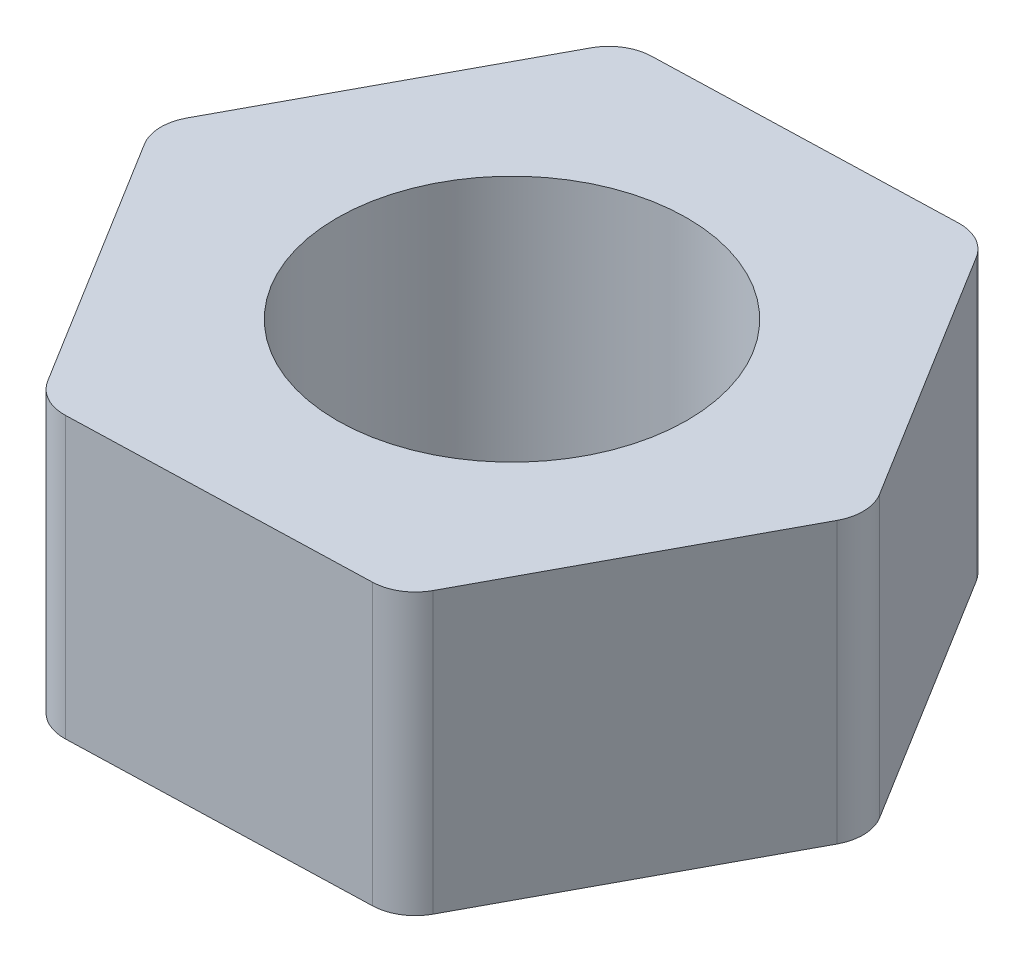
ISO-10303-21;
HEADER;
FILE_DESCRIPTION(('STEP AP214'),'2;1');
FILE_NAME('part.step','',(''),(''),'','','');
FILE_SCHEMA(('AUTOMOTIVE_DESIGN { 1 0 10303 214 1 1 1 1 }'));
ENDSEC;
DATA;
#1=APPLICATION_CONTEXT('core data for automotive mechanical design processes');
#2=APPLICATION_PROTOCOL_DEFINITION('international standard','automotive_design',2000,#1);
#3=PRODUCT_CONTEXT('',#1,'mechanical');
#4=PRODUCT('Part','Part','',(#3));
#5=PRODUCT_RELATED_PRODUCT_CATEGORY('part','',(#4));
#6=PRODUCT_DEFINITION_FORMATION('','',#4);
#7=PRODUCT_DEFINITION_CONTEXT('part definition',#1,'design');
#8=PRODUCT_DEFINITION('design','',#6,#7);
#9=PRODUCT_DEFINITION_SHAPE('','',#8);
#10=(LENGTH_UNIT() NAMED_UNIT(*) SI_UNIT(.MILLI.,.METRE.));
#11=(NAMED_UNIT(*) PLANE_ANGLE_UNIT() SI_UNIT($,.RADIAN.));
#12=(NAMED_UNIT(*) SI_UNIT($,.STERADIAN.) SOLID_ANGLE_UNIT());
#13=UNCERTAINTY_MEASURE_WITH_UNIT(LENGTH_MEASURE(1.E-05),#10,'distance_accuracy_value','');
#14=(GEOMETRIC_REPRESENTATION_CONTEXT(3) GLOBAL_UNCERTAINTY_ASSIGNED_CONTEXT((#13)) GLOBAL_UNIT_ASSIGNED_CONTEXT((#10,
#11,#12)) REPRESENTATION_CONTEXT('',''));
#15=CARTESIAN_POINT('',(0.,0.,0.));
#16=DIRECTION('',(0.,0.,1.));
#17=DIRECTION('',(1.,0.,0.));
#18=AXIS2_PLACEMENT_3D('',#15,#16,#17);
#19=CARTESIAN_POINT('',(0.,3.2,0.));
#20=DIRECTION('',(0.,1.,0.));
#21=DIRECTION('',(0.,0.,1.));
#22=AXIS2_PLACEMENT_3D('',#19,#20,#21);
#23=PLANE('',#22);
#24=DIRECTION('',(-0.473531335602983,0.,0.880776971884515));
#25=VECTOR('',#24,1.);
#26=CARTESIAN_POINT('',(-2.09547317092521,3.2,-3.38806614308703));
#27=LINE('',#26,#25);
#28=CARTESIAN_POINT('',(-2.23216989296526,3.2,-3.13380773218026));
#29=VERTEX_POINT('',#28);
#30=CARTESIAN_POINT('',(-3.84519121303789,3.2,-0.133558483480325));
#31=VERTEX_POINT('',#30);
#32=EDGE_CURVE('E268',#29,#31,#27,.T.);
#33=ORIENTED_EDGE('',*,*,#32,.T.);
#34=CARTESIAN_POINT('',(-3.40480272709563,3.2,0.103207184321166));
#35=DIRECTION('',(0.,1.,0.));
#36=DIRECTION('',(0.,0.,1.));
#37=AXIS2_PLACEMENT_3D('',#34,#35,#36);
#38=CIRCLE('',#37,0.5);
#39=CARTESIAN_POINT('',(-3.83004205312684,3.2,0.366211966780582));
#40=VERTEX_POINT('',#39);
#41=EDGE_CURVE('E206',#31,#40,#38,.T.);
#42=ORIENTED_EDGE('',*,*,#41,.T.);
#43=DIRECTION('',(0.526009564918831,0.,0.850478652062415));
#44=VECTOR('',#43,1.);
#45=CARTESIAN_POINT('',(-3.98188793507794,3.2,0.120699927426449));
#46=LINE('',#45,#44);
#47=CARTESIAN_POINT('',(-2.03826064610383,3.2,3.26325403115935));
#48=VERTEX_POINT('',#47);
#49=EDGE_CURVE('E151',#40,#48,#46,.T.);
#50=ORIENTED_EDGE('',*,*,#49,.T.);
#51=CARTESIAN_POINT('',(-1.61302132007262,3.2,3.00024924869993));
#52=DIRECTION('',(0.,1.,0.));
#53=DIRECTION('',(0.,0.,1.));
#54=AXIS2_PLACEMENT_3D('',#51,#52,#53);
#55=CIRCLE('',#54,0.5);
#56=CARTESIAN_POINT('',(-1.59787216016157,3.2,3.50001969896084));
#57=VERTEX_POINT('',#56);
#58=EDGE_CURVE('E192',#48,#57,#55,.T.);
#59=ORIENTED_EDGE('',*,*,#58,.T.);
#60=DIRECTION('',(0.999540900521813,0.,-0.0302983198220993));
#61=VECTOR('',#60,1.);
#62=CARTESIAN_POINT('',(-1.88641476415272,3.2,3.50876607051348));
#63=LINE('',#62,#61);
#64=CARTESIAN_POINT('',(1.80693056693406,3.2,3.39681251463967));
#65=VERTEX_POINT('',#64);
#66=EDGE_CURVE('E160',#57,#65,#63,.T.);
#67=ORIENTED_EDGE('',*,*,#66,.T.);
#68=CARTESIAN_POINT('',(1.79178140702301,3.2,2.89704206437877));
#69=DIRECTION('',(0.,1.,0.));
#70=DIRECTION('',(0.,0.,1.));
#71=AXIS2_PLACEMENT_3D('',#68,#69,#70);
#72=CIRCLE('',#71,0.5);
#73=CARTESIAN_POINT('',(2.23216989296527,3.2,3.13380773218026));
#74=VERTEX_POINT('',#73);
#75=EDGE_CURVE('E195',#65,#74,#72,.T.);
#76=ORIENTED_EDGE('',*,*,#75,.T.);
#77=DIRECTION('',(0.473531335602983,0.,-0.880776971884515));
#78=VECTOR('',#77,1.);
#79=CARTESIAN_POINT('',(2.09547317092521,3.2,3.38806614308703));
#80=LINE('',#79,#78);
#81=CARTESIAN_POINT('',(3.84519121303789,3.2,0.133558483480324));
#82=VERTEX_POINT('',#81);
#83=EDGE_CURVE('E166',#74,#82,#80,.T.);
#84=ORIENTED_EDGE('',*,*,#83,.T.);
#85=CARTESIAN_POINT('',(3.40480272709563,3.2,-0.103207184321166));
#86=DIRECTION('',(0.,1.,0.));
#87=DIRECTION('',(0.,0.,1.));
#88=AXIS2_PLACEMENT_3D('',#85,#86,#87);
#89=CIRCLE('',#88,0.5);
#90=CARTESIAN_POINT('',(3.83004205312684,3.2,-0.366211966780582));
#91=VERTEX_POINT('',#90);
#92=EDGE_CURVE('E198',#82,#91,#89,.T.);
#93=ORIENTED_EDGE('',*,*,#92,.T.);
#94=DIRECTION('',(-0.52600956491883,0.,-0.850478652062415));
#95=VECTOR('',#94,1.);
#96=CARTESIAN_POINT('',(3.98188793507794,3.2,-0.120699927426449));
#97=LINE('',#96,#95);
#98=CARTESIAN_POINT('',(2.03826064610383,3.2,-3.26325403115935));
#99=VERTEX_POINT('',#98);
#100=EDGE_CURVE('E275',#91,#99,#97,.T.);
#101=ORIENTED_EDGE('',*,*,#100,.T.);
#102=CARTESIAN_POINT('',(1.61302132007262,3.2,-3.00024924869993));
#103=DIRECTION('',(0.,1.,0.));
#104=DIRECTION('',(0.,0.,1.));
#105=AXIS2_PLACEMENT_3D('',#102,#103,#104);
#106=CIRCLE('',#105,0.5);
#107=CARTESIAN_POINT('',(1.59787216016157,3.2,-3.50001969896084));
#108=VERTEX_POINT('',#107);
#109=EDGE_CURVE('E62',#99,#108,#106,.T.);
#110=ORIENTED_EDGE('',*,*,#109,.T.);
#111=DIRECTION('',(-0.999540900521814,0.,0.0302983198220996));
#112=VECTOR('',#111,1.);
#113=CARTESIAN_POINT('',(1.88641476415273,3.2,-3.50876607051348));
#114=LINE('',#113,#112);
#115=CARTESIAN_POINT('',(-1.80693056693406,3.2,-3.39681251463967));
#116=VERTEX_POINT('',#115);
#117=EDGE_CURVE('E269',#108,#116,#114,.T.);
#118=ORIENTED_EDGE('',*,*,#117,.T.);
#119=CARTESIAN_POINT('',(-1.79178140702301,3.2,-2.89704206437877));
#120=DIRECTION('',(0.,1.,0.));
#121=DIRECTION('',(0.,0.,1.));
#122=AXIS2_PLACEMENT_3D('',#119,#120,#121);
#123=CIRCLE('',#122,0.5);
#124=EDGE_CURVE('E203',#116,#29,#123,.T.);
#125=ORIENTED_EDGE('',*,*,#124,.T.);
#126=EDGE_LOOP('',(#33,#42,#50,#59,#67,#76,#84,#93,#101,#110,#118,#125));
#127=FACE_BOUND('',#126,.T.);
#128=CARTESIAN_POINT('',(0.,3.2,0.));
#129=DIRECTION('',(0.,1.,0.));
#130=DIRECTION('',(0.,0.,1.));
#131=AXIS2_PLACEMENT_3D('',#128,#129,#130);
#132=CIRCLE('',#131,2.);
#133=CARTESIAN_POINT('',(0.,3.2,2.));
#134=VERTEX_POINT('',#133);
#135=EDGE_CURVE('E242',#134,#134,#132,.T.);
#136=ORIENTED_EDGE('',*,*,#135,.F.);
#137=EDGE_LOOP('',(#136));
#138=FACE_BOUND('',#137,.T.);
#139=ADVANCED_FACE('F39',(#127,#138),#23,.T.);
#140=CARTESIAN_POINT('',(0.,0.,0.));
#141=DIRECTION('',(0.,1.,0.));
#142=DIRECTION('',(0.,0.,1.));
#143=AXIS2_PLACEMENT_3D('',#140,#141,#142);
#144=PLANE('',#143);
#145=DIRECTION('',(0.526009564918831,0.,0.850478652062415));
#146=VECTOR('',#145,1.);
#147=CARTESIAN_POINT('',(-3.98188793507794,0.,0.120699927426449));
#148=LINE('',#147,#146);
#149=CARTESIAN_POINT('',(-3.83004205312684,0.,0.366211966780582));
#150=VERTEX_POINT('',#149);
#151=CARTESIAN_POINT('',(-2.03826064610383,0.,3.26325403115935));
#152=VERTEX_POINT('',#151);
#153=EDGE_CURVE('E148',#150,#152,#148,.T.);
#154=ORIENTED_EDGE('',*,*,#153,.F.);
#155=CARTESIAN_POINT('',(-3.40480272709563,0.,0.103207184321166));
#156=DIRECTION('',(0.,1.,0.));
#157=DIRECTION('',(0.,0.,1.));
#158=AXIS2_PLACEMENT_3D('',#155,#156,#157);
#159=CIRCLE('',#158,0.5);
#160=CARTESIAN_POINT('',(-3.84519121303789,0.,-0.133558483480325));
#161=VERTEX_POINT('',#160);
#162=EDGE_CURVE('E130',#150,#161,#159,.F.);
#163=ORIENTED_EDGE('',*,*,#162,.T.);
#164=DIRECTION('',(-0.473531335602983,0.,0.880776971884515));
#165=VECTOR('',#164,1.);
#166=CARTESIAN_POINT('',(-2.09547317092521,0.,-3.38806614308703));
#167=LINE('',#166,#165);
#168=CARTESIAN_POINT('',(-2.23216989296526,0.,-3.13380773218026));
#169=VERTEX_POINT('',#168);
#170=EDGE_CURVE('E161',#169,#161,#167,.T.);
#171=ORIENTED_EDGE('',*,*,#170,.F.);
#172=CARTESIAN_POINT('',(-1.79178140702301,0.,-2.89704206437877));
#173=DIRECTION('',(0.,1.,0.));
#174=DIRECTION('',(0.,0.,1.));
#175=AXIS2_PLACEMENT_3D('',#172,#173,#174);
#176=CIRCLE('',#175,0.5);
#177=CARTESIAN_POINT('',(-1.80693056693406,0.,-3.39681251463967));
#178=VERTEX_POINT('',#177);
#179=EDGE_CURVE('E142',#169,#178,#176,.F.);
#180=ORIENTED_EDGE('',*,*,#179,.T.);
#181=DIRECTION('',(-0.999540900521814,0.,0.0302983198220996));
#182=VECTOR('',#181,1.);
#183=CARTESIAN_POINT('',(1.88641476415273,0.,-3.50876607051348));
#184=LINE('',#183,#182);
#185=CARTESIAN_POINT('',(1.59787216016157,0.,-3.50001969896084));
#186=VERTEX_POINT('',#185);
#187=EDGE_CURVE('E168',#186,#178,#184,.T.);
#188=ORIENTED_EDGE('',*,*,#187,.F.);
#189=CARTESIAN_POINT('',(1.61302132007262,0.,-3.00024924869993));
#190=DIRECTION('',(0.,1.,0.));
#191=DIRECTION('',(0.,0.,1.));
#192=AXIS2_PLACEMENT_3D('',#189,#190,#191);
#193=CIRCLE('',#192,0.5);
#194=CARTESIAN_POINT('',(2.03826064610383,0.,-3.26325403115935));
#195=VERTEX_POINT('',#194);
#196=EDGE_CURVE('E182',#186,#195,#193,.F.);
#197=ORIENTED_EDGE('',*,*,#196,.T.);
#198=DIRECTION('',(-0.52600956491883,0.,-0.850478652062415));
#199=VECTOR('',#198,1.);
#200=CARTESIAN_POINT('',(3.98188793507794,0.,-0.120699927426449));
#201=LINE('',#200,#199);
#202=CARTESIAN_POINT('',(3.83004205312684,0.,-0.366211966780582));
#203=VERTEX_POINT('',#202);
#204=EDGE_CURVE('E247',#203,#195,#201,.T.);
#205=ORIENTED_EDGE('',*,*,#204,.F.);
#206=CARTESIAN_POINT('',(3.40480272709563,0.,-0.103207184321166));
#207=DIRECTION('',(0.,1.,0.));
#208=DIRECTION('',(0.,0.,1.));
#209=AXIS2_PLACEMENT_3D('',#206,#207,#208);
#210=CIRCLE('',#209,0.5);
#211=CARTESIAN_POINT('',(3.84519121303789,0.,0.133558483480324));
#212=VERTEX_POINT('',#211);
#213=EDGE_CURVE('E179',#203,#212,#210,.F.);
#214=ORIENTED_EDGE('',*,*,#213,.T.);
#215=DIRECTION('',(0.473531335602983,0.,-0.880776971884515));
#216=VECTOR('',#215,1.);
#217=CARTESIAN_POINT('',(2.09547317092521,0.,3.38806614308703));
#218=LINE('',#217,#216);
#219=CARTESIAN_POINT('',(2.23216989296527,0.,3.13380773218026));
#220=VERTEX_POINT('',#219);
#221=EDGE_CURVE('E241',#220,#212,#218,.T.);
#222=ORIENTED_EDGE('',*,*,#221,.F.);
#223=CARTESIAN_POINT('',(1.79178140702301,0.,2.89704206437877));
#224=DIRECTION('',(0.,1.,0.));
#225=DIRECTION('',(0.,0.,1.));
#226=AXIS2_PLACEMENT_3D('',#223,#224,#225);
#227=CIRCLE('',#226,0.5);
#228=CARTESIAN_POINT('',(1.80693056693406,0.,3.39681251463967));
#229=VERTEX_POINT('',#228);
#230=EDGE_CURVE('E176',#220,#229,#227,.F.);
#231=ORIENTED_EDGE('',*,*,#230,.T.);
#232=DIRECTION('',(0.999540900521813,0.,-0.0302983198220993));
#233=VECTOR('',#232,1.);
#234=CARTESIAN_POINT('',(-1.88641476415272,0.,3.50876607051348));
#235=LINE('',#234,#233);
#236=CARTESIAN_POINT('',(-1.59787216016157,0.,3.50001969896084));
#237=VERTEX_POINT('',#236);
#238=EDGE_CURVE('E235',#237,#229,#235,.T.);
#239=ORIENTED_EDGE('',*,*,#238,.F.);
#240=CARTESIAN_POINT('',(-1.61302132007262,0.,3.00024924869993));
#241=DIRECTION('',(0.,1.,0.));
#242=DIRECTION('',(0.,0.,1.));
#243=AXIS2_PLACEMENT_3D('',#240,#241,#242);
#244=CIRCLE('',#243,0.5);
#245=EDGE_CURVE('E153',#237,#152,#244,.F.);
#246=ORIENTED_EDGE('',*,*,#245,.T.);
#247=EDGE_LOOP('',(#154,#163,#171,#180,#188,#197,#205,#214,#222,#231,#239,#246));
#248=FACE_BOUND('',#247,.T.);
#249=CARTESIAN_POINT('',(0.,0.,0.));
#250=DIRECTION('',(0.,1.,0.));
#251=DIRECTION('',(0.,0.,1.));
#252=AXIS2_PLACEMENT_3D('',#249,#250,#251);
#253=CIRCLE('',#252,2.);
#254=CARTESIAN_POINT('',(0.,0.,2.));
#255=VERTEX_POINT('',#254);
#256=EDGE_CURVE('E250',#255,#255,#253,.T.);
#257=ORIENTED_EDGE('',*,*,#256,.T.);
#258=EDGE_LOOP('',(#257));
#259=FACE_BOUND('',#258,.T.);
#260=ADVANCED_FACE('F156',(#248,#259),#144,.F.);
#261=CARTESIAN_POINT('',(-1.88641476415272,3.2,3.50876607051348));
#262=DIRECTION('',(-0.0302983198220993,0.,-0.999540900521814));
#263=DIRECTION('',(-0.999540900521814,0.,0.0302983198220993));
#264=AXIS2_PLACEMENT_3D('',#261,#262,#263);
#265=PLANE('',#264);
#266=ORIENTED_EDGE('',*,*,#238,.T.);
#267=DIRECTION('',(0.,-1.,0.));
#268=VECTOR('',#267,1.);
#269=CARTESIAN_POINT('',(1.80693056693406,3.2,3.39681251463967));
#270=LINE('',#269,#268);
#271=EDGE_CURVE('E11',#229,#65,#270,.F.);
#272=ORIENTED_EDGE('',*,*,#271,.T.);
#273=ORIENTED_EDGE('',*,*,#66,.F.);
#274=DIRECTION('',(0.,-1.,0.));
#275=VECTOR('',#274,1.);
#276=CARTESIAN_POINT('',(-1.59787216016157,3.2,3.50001969896084));
#277=LINE('',#276,#275);
#278=EDGE_CURVE('E48',#57,#237,#277,.T.);
#279=ORIENTED_EDGE('',*,*,#278,.T.);
#280=EDGE_LOOP('',(#266,#272,#273,#279));
#281=FACE_BOUND('',#280,.T.);
#282=ADVANCED_FACE('F234',(#281),#265,.F.);
#283=CARTESIAN_POINT('',(2.09547317092521,3.2,3.38806614308703));
#284=DIRECTION('',(-0.880776971884515,0.,-0.473531335602983));
#285=DIRECTION('',(-0.473531335602983,0.,0.880776971884515));
#286=AXIS2_PLACEMENT_3D('',#283,#284,#285);
#287=PLANE('',#286);
#288=ORIENTED_EDGE('',*,*,#221,.T.);
#289=DIRECTION('',(0.,-1.,0.));
#290=VECTOR('',#289,1.);
#291=CARTESIAN_POINT('',(3.84519121303789,3.2,0.133558483480325));
#292=LINE('',#291,#290);
#293=EDGE_CURVE('E226',#212,#82,#292,.F.);
#294=ORIENTED_EDGE('',*,*,#293,.T.);
#295=ORIENTED_EDGE('',*,*,#83,.F.);
#296=DIRECTION('',(0.,-1.,0.));
#297=VECTOR('',#296,1.);
#298=CARTESIAN_POINT('',(2.23216989296527,3.2,3.13380773218026));
#299=LINE('',#298,#297);
#300=EDGE_CURVE('E222',#74,#220,#299,.T.);
#301=ORIENTED_EDGE('',*,*,#300,.T.);
#302=EDGE_LOOP('',(#288,#294,#295,#301));
#303=FACE_BOUND('',#302,.T.);
#304=ADVANCED_FACE('F311',(#303),#287,.F.);
#305=CARTESIAN_POINT('',(3.98188793507794,3.2,-0.120699927426449));
#306=DIRECTION('',(-0.850478652062415,0.,0.52600956491883));
#307=DIRECTION('',(0.526009564918831,0.,0.850478652062415));
#308=AXIS2_PLACEMENT_3D('',#305,#306,#307);
#309=PLANE('',#308);
#310=ORIENTED_EDGE('',*,*,#204,.T.);
#311=DIRECTION('',(0.,-1.,0.));
#312=VECTOR('',#311,1.);
#313=CARTESIAN_POINT('',(2.03826064610383,3.2,-3.26325403115935));
#314=LINE('',#313,#312);
#315=EDGE_CURVE('E219',#195,#99,#314,.F.);
#316=ORIENTED_EDGE('',*,*,#315,.T.);
#317=ORIENTED_EDGE('',*,*,#100,.F.);
#318=DIRECTION('',(0.,-1.,0.));
#319=VECTOR('',#318,1.);
#320=CARTESIAN_POINT('',(3.83004205312684,3.2,-0.366211966780582));
#321=LINE('',#320,#319);
#322=EDGE_CURVE('E215',#91,#203,#321,.T.);
#323=ORIENTED_EDGE('',*,*,#322,.T.);
#324=EDGE_LOOP('',(#310,#316,#317,#323));
#325=FACE_BOUND('',#324,.T.);
#326=ADVANCED_FACE('F308',(#325),#309,.F.);
#327=CARTESIAN_POINT('',(1.88641476415273,3.2,-3.50876607051348));
#328=DIRECTION('',(0.0302983198220996,0.,0.999540900521814));
#329=DIRECTION('',(0.999540900521814,0.,-0.0302983198220996));
#330=AXIS2_PLACEMENT_3D('',#327,#328,#329);
#331=PLANE('',#330);
#332=ORIENTED_EDGE('',*,*,#187,.T.);
#333=DIRECTION('',(0.,-1.,0.));
#334=VECTOR('',#333,1.);
#335=CARTESIAN_POINT('',(-1.80693056693406,3.2,-3.39681251463967));
#336=LINE('',#335,#334);
#337=EDGE_CURVE('E55',#178,#116,#336,.F.);
#338=ORIENTED_EDGE('',*,*,#337,.T.);
#339=ORIENTED_EDGE('',*,*,#117,.F.);
#340=DIRECTION('',(0.,-1.,0.));
#341=VECTOR('',#340,1.);
#342=CARTESIAN_POINT('',(1.59787216016157,3.2,-3.50001969896084));
#343=LINE('',#342,#341);
#344=EDGE_CURVE('E209',#108,#186,#343,.T.);
#345=ORIENTED_EDGE('',*,*,#344,.T.);
#346=EDGE_LOOP('',(#332,#338,#339,#345));
#347=FACE_BOUND('',#346,.T.);
#348=ADVANCED_FACE('F259',(#347),#331,.F.);
#349=CARTESIAN_POINT('',(-2.09547317092521,3.2,-3.38806614308703));
#350=DIRECTION('',(0.880776971884515,0.,0.473531335602983));
#351=DIRECTION('',(0.473531335602983,0.,-0.880776971884515));
#352=AXIS2_PLACEMENT_3D('',#349,#350,#351);
#353=PLANE('',#352);
#354=ORIENTED_EDGE('',*,*,#170,.T.);
#355=DIRECTION('',(0.,-1.,0.));
#356=VECTOR('',#355,1.);
#357=CARTESIAN_POINT('',(-3.84519121303789,3.2,-0.133558483480326));
#358=LINE('',#357,#356);
#359=EDGE_CURVE('E135',#161,#31,#358,.F.);
#360=ORIENTED_EDGE('',*,*,#359,.T.);
#361=ORIENTED_EDGE('',*,*,#32,.F.);
#362=DIRECTION('',(0.,-1.,0.));
#363=VECTOR('',#362,1.);
#364=CARTESIAN_POINT('',(-2.23216989296526,3.2,-3.13380773218026));
#365=LINE('',#364,#363);
#366=EDGE_CURVE('E141',#29,#169,#365,.T.);
#367=ORIENTED_EDGE('',*,*,#366,.T.);
#368=EDGE_LOOP('',(#354,#360,#361,#367));
#369=FACE_BOUND('',#368,.T.);
#370=ADVANCED_FACE('F271',(#369),#353,.F.);
#371=CARTESIAN_POINT('',(-3.98188793507794,3.2,0.120699927426449));
#372=DIRECTION('',(0.850478652062415,0.,-0.52600956491883));
#373=DIRECTION('',(-0.526009564918831,0.,-0.850478652062415));
#374=AXIS2_PLACEMENT_3D('',#371,#372,#373);
#375=PLANE('',#374);
#376=ORIENTED_EDGE('',*,*,#49,.F.);
#377=DIRECTION('',(0.,-1.,0.));
#378=VECTOR('',#377,1.);
#379=CARTESIAN_POINT('',(-3.83004205312684,3.2,0.366211966780582));
#380=LINE('',#379,#378);
#381=EDGE_CURVE('E134',#40,#150,#380,.T.);
#382=ORIENTED_EDGE('',*,*,#381,.T.);
#383=ORIENTED_EDGE('',*,*,#153,.T.);
#384=DIRECTION('',(0.,-1.,0.));
#385=VECTOR('',#384,1.);
#386=CARTESIAN_POINT('',(-2.03826064610383,3.2,3.26325403115935));
#387=LINE('',#386,#385);
#388=EDGE_CURVE('E154',#152,#48,#387,.F.);
#389=ORIENTED_EDGE('',*,*,#388,.T.);
#390=EDGE_LOOP('',(#376,#382,#383,#389));
#391=FACE_BOUND('',#390,.T.);
#392=ADVANCED_FACE('F147',(#391),#375,.F.);
#393=CARTESIAN_POINT('',(0.,3.2,0.));
#394=DIRECTION('',(0.,-1.,0.));
#395=DIRECTION('',(0.,0.,-1.));
#396=AXIS2_PLACEMENT_3D('',#393,#394,#395);
#397=CYLINDRICAL_SURFACE('',#396,2.);
#398=ORIENTED_EDGE('',*,*,#135,.T.);
#399=EDGE_LOOP('',(#398));
#400=FACE_BOUND('',#399,.T.);
#401=ORIENTED_EDGE('',*,*,#256,.F.);
#402=EDGE_LOOP('',(#401));
#403=FACE_BOUND('',#402,.T.);
#404=ADVANCED_FACE('F287',(#400,#403),#397,.F.);
#405=CARTESIAN_POINT('',(-3.40480272709563,3.2,0.103207184321166));
#406=DIRECTION('',(0.,-1.,0.));
#407=DIRECTION('',(0.,0.,-1.));
#408=AXIS2_PLACEMENT_3D('',#405,#406,#407);
#409=CYLINDRICAL_SURFACE('',#408,0.5);
#410=ORIENTED_EDGE('',*,*,#41,.F.);
#411=ORIENTED_EDGE('',*,*,#359,.F.);
#412=ORIENTED_EDGE('',*,*,#162,.F.);
#413=ORIENTED_EDGE('',*,*,#381,.F.);
#414=EDGE_LOOP('',(#410,#411,#412,#413));
#415=FACE_BOUND('',#414,.T.);
#416=ADVANCED_FACE('F133',(#415),#409,.T.);
#417=CARTESIAN_POINT('',(-1.79178140702301,3.2,-2.89704206437877));
#418=DIRECTION('',(0.,-1.,0.));
#419=DIRECTION('',(0.,0.,-1.));
#420=AXIS2_PLACEMENT_3D('',#417,#418,#419);
#421=CYLINDRICAL_SURFACE('',#420,0.5);
#422=ORIENTED_EDGE('',*,*,#124,.F.);
#423=ORIENTED_EDGE('',*,*,#337,.F.);
#424=ORIENTED_EDGE('',*,*,#179,.F.);
#425=ORIENTED_EDGE('',*,*,#366,.F.);
#426=EDGE_LOOP('',(#422,#423,#424,#425));
#427=FACE_BOUND('',#426,.T.);
#428=ADVANCED_FACE('F263',(#427),#421,.T.);
#429=CARTESIAN_POINT('',(1.61302132007262,3.2,-3.00024924869993));
#430=DIRECTION('',(0.,-1.,0.));
#431=DIRECTION('',(0.,0.,-1.));
#432=AXIS2_PLACEMENT_3D('',#429,#430,#431);
#433=CYLINDRICAL_SURFACE('',#432,0.5);
#434=ORIENTED_EDGE('',*,*,#109,.F.);
#435=ORIENTED_EDGE('',*,*,#315,.F.);
#436=ORIENTED_EDGE('',*,*,#196,.F.);
#437=ORIENTED_EDGE('',*,*,#344,.F.);
#438=EDGE_LOOP('',(#434,#435,#436,#437));
#439=FACE_BOUND('',#438,.T.);
#440=ADVANCED_FACE('F320',(#439),#433,.T.);
#441=CARTESIAN_POINT('',(3.40480272709563,3.2,-0.103207184321166));
#442=DIRECTION('',(0.,-1.,0.));
#443=DIRECTION('',(0.,0.,-1.));
#444=AXIS2_PLACEMENT_3D('',#441,#442,#443);
#445=CYLINDRICAL_SURFACE('',#444,0.5);
#446=ORIENTED_EDGE('',*,*,#92,.F.);
#447=ORIENTED_EDGE('',*,*,#293,.F.);
#448=ORIENTED_EDGE('',*,*,#213,.F.);
#449=ORIENTED_EDGE('',*,*,#322,.F.);
#450=EDGE_LOOP('',(#446,#447,#448,#449));
#451=FACE_BOUND('',#450,.T.);
#452=ADVANCED_FACE('F323',(#451),#445,.T.);
#453=CARTESIAN_POINT('',(1.79178140702301,3.2,2.89704206437877));
#454=DIRECTION('',(0.,-1.,0.));
#455=DIRECTION('',(0.,0.,-1.));
#456=AXIS2_PLACEMENT_3D('',#453,#454,#455);
#457=CYLINDRICAL_SURFACE('',#456,0.5);
#458=ORIENTED_EDGE('',*,*,#75,.F.);
#459=ORIENTED_EDGE('',*,*,#271,.F.);
#460=ORIENTED_EDGE('',*,*,#230,.F.);
#461=ORIENTED_EDGE('',*,*,#300,.F.);
#462=EDGE_LOOP('',(#458,#459,#460,#461));
#463=FACE_BOUND('',#462,.T.);
#464=ADVANCED_FACE('F326',(#463),#457,.T.);
#465=CARTESIAN_POINT('',(-1.61302132007262,3.2,3.00024924869993));
#466=DIRECTION('',(0.,-1.,0.));
#467=DIRECTION('',(0.,0.,-1.));
#468=AXIS2_PLACEMENT_3D('',#465,#466,#467);
#469=CYLINDRICAL_SURFACE('',#468,0.5);
#470=ORIENTED_EDGE('',*,*,#58,.F.);
#471=ORIENTED_EDGE('',*,*,#388,.F.);
#472=ORIENTED_EDGE('',*,*,#245,.F.);
#473=ORIENTED_EDGE('',*,*,#278,.F.);
#474=EDGE_LOOP('',(#470,#471,#472,#473));
#475=FACE_BOUND('',#474,.T.);
#476=ADVANCED_FACE('F41',(#475),#469,.T.);
#477=CLOSED_SHELL('',(#139,#260,#282,#304,#326,#348,#370,#392,#404,#416,#428,#440,#452,#464,#476));
#478=MANIFOLD_SOLID_BREP('B2',#477);
#479=ADVANCED_BREP_SHAPE_REPRESENTATION('',(#18,#478),#14);
#480=SHAPE_DEFINITION_REPRESENTATION(#9,#479);
ENDSEC;
END-ISO-10303-21;
